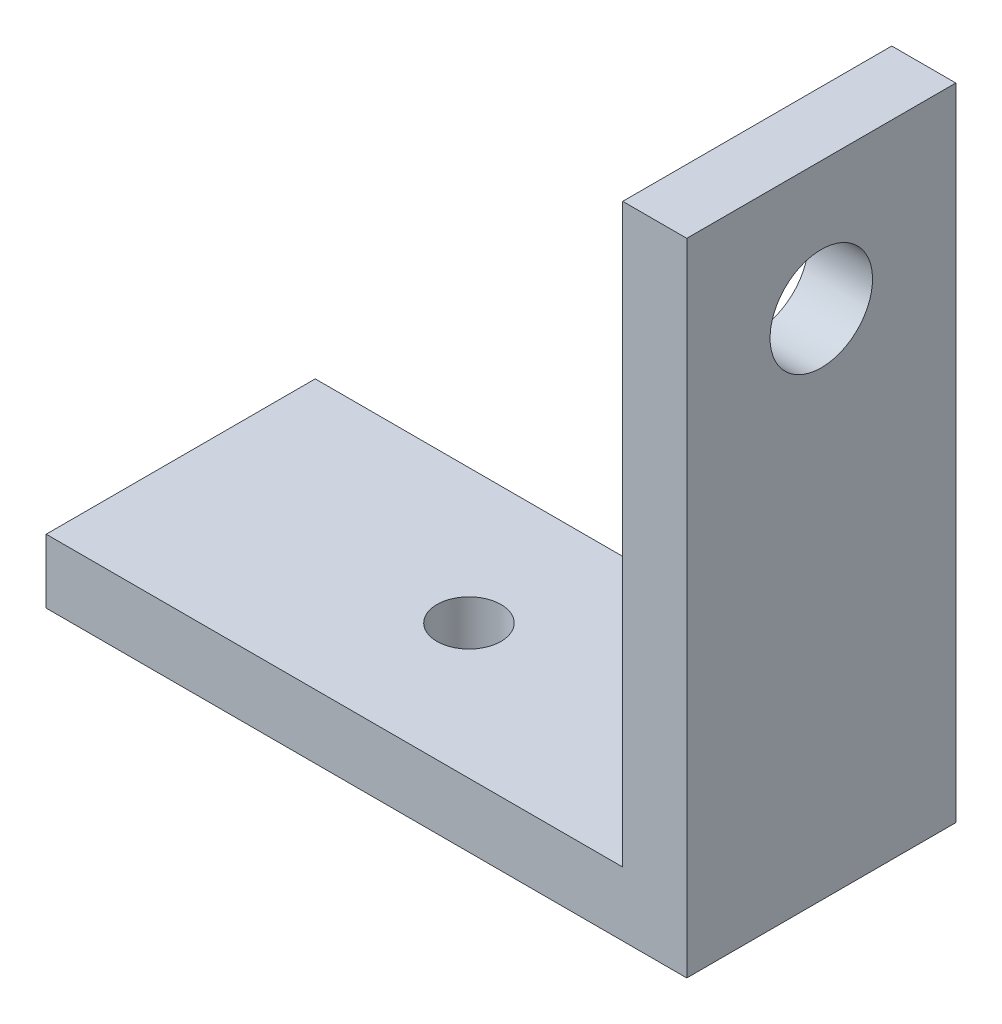
ISO-10303-21;
HEADER;
FILE_DESCRIPTION(('STEP AP214'),'2;1');
FILE_NAME('part.step','',(''),(''),'','','');
FILE_SCHEMA(('AUTOMOTIVE_DESIGN { 1 0 10303 214 1 1 1 1 }'));
ENDSEC;
DATA;
#1=APPLICATION_CONTEXT('core data for automotive mechanical design processes');
#2=APPLICATION_PROTOCOL_DEFINITION('international standard','automotive_design',2000,#1);
#3=PRODUCT_CONTEXT('',#1,'mechanical');
#4=PRODUCT('Part','Part','',(#3));
#5=PRODUCT_RELATED_PRODUCT_CATEGORY('part','',(#4));
#6=PRODUCT_DEFINITION_FORMATION('','',#4);
#7=PRODUCT_DEFINITION_CONTEXT('part definition',#1,'design');
#8=PRODUCT_DEFINITION('design','',#6,#7);
#9=PRODUCT_DEFINITION_SHAPE('','',#8);
#10=(LENGTH_UNIT() NAMED_UNIT(*) SI_UNIT(.MILLI.,.METRE.));
#11=(NAMED_UNIT(*) PLANE_ANGLE_UNIT() SI_UNIT($,.RADIAN.));
#12=(NAMED_UNIT(*) SI_UNIT($,.STERADIAN.) SOLID_ANGLE_UNIT());
#13=UNCERTAINTY_MEASURE_WITH_UNIT(LENGTH_MEASURE(1.E-05),#10,'distance_accuracy_value','');
#14=(GEOMETRIC_REPRESENTATION_CONTEXT(3) GLOBAL_UNCERTAINTY_ASSIGNED_CONTEXT((#13)) GLOBAL_UNIT_ASSIGNED_CONTEXT((#10,
#11,#12)) REPRESENTATION_CONTEXT('',''));
#15=CARTESIAN_POINT('',(0.,0.,0.));
#16=DIRECTION('',(0.,0.,1.));
#17=DIRECTION('',(1.,0.,0.));
#18=AXIS2_PLACEMENT_3D('',#15,#16,#17);
#19=CARTESIAN_POINT('',(-50.,0.,21.));
#20=DIRECTION('',(0.,1.,0.));
#21=DIRECTION('',(0.,0.,1.));
#22=AXIS2_PLACEMENT_3D('',#19,#20,#21);
#23=PLANE('',#22);
#24=CARTESIAN_POINT('',(-27.5,0.,10.5));
#25=DIRECTION('',(0.,1.,0.));
#26=DIRECTION('',(0.,0.,1.));
#27=AXIS2_PLACEMENT_3D('',#24,#25,#26);
#28=CIRCLE('',#27,2.5);
#29=CARTESIAN_POINT('',(-27.5,0.,13.));
#30=VERTEX_POINT('',#29);
#31=EDGE_CURVE('E189',#30,#30,#28,.T.);
#32=ORIENTED_EDGE('',*,*,#31,.T.);
#33=EDGE_LOOP('',(#32));
#34=FACE_BOUND('',#33,.T.);
#35=DIRECTION('',(1.,0.,0.));
#36=VECTOR('',#35,1.);
#37=CARTESIAN_POINT('',(-50.,0.,0.));
#38=LINE('',#37,#36);
#39=CARTESIAN_POINT('',(-50.,0.,0.));
#40=VERTEX_POINT('',#39);
#41=CARTESIAN_POINT('',(0.,0.,0.));
#42=VERTEX_POINT('',#41);
#43=EDGE_CURVE('E132',#40,#42,#38,.T.);
#44=ORIENTED_EDGE('',*,*,#43,.T.);
#45=DIRECTION('',(0.,0.,-1.));
#46=VECTOR('',#45,1.);
#47=CARTESIAN_POINT('',(0.,0.,21.));
#48=LINE('',#47,#46);
#49=CARTESIAN_POINT('',(0.,0.,21.));
#50=VERTEX_POINT('',#49);
#51=EDGE_CURVE('E11',#50,#42,#48,.T.);
#52=ORIENTED_EDGE('',*,*,#51,.F.);
#53=DIRECTION('',(1.,0.,0.));
#54=VECTOR('',#53,1.);
#55=CARTESIAN_POINT('',(-50.,0.,21.));
#56=LINE('',#55,#54);
#57=CARTESIAN_POINT('',(-50.,0.,21.));
#58=VERTEX_POINT('',#57);
#59=EDGE_CURVE('E149',#58,#50,#56,.T.);
#60=ORIENTED_EDGE('',*,*,#59,.F.);
#61=DIRECTION('',(0.,0.,-1.));
#62=VECTOR('',#61,1.);
#63=CARTESIAN_POINT('',(-50.,0.,21.));
#64=LINE('',#63,#62);
#65=EDGE_CURVE('E128',#58,#40,#64,.T.);
#66=ORIENTED_EDGE('',*,*,#65,.T.);
#67=EDGE_LOOP('',(#44,#52,#60,#66));
#68=FACE_BOUND('',#67,.T.);
#69=ADVANCED_FACE('F42',(#34,#68),#23,.F.);
#70=CARTESIAN_POINT('',(0.,0.,21.));
#71=DIRECTION('',(-1.,0.,0.));
#72=DIRECTION('',(0.,0.,1.));
#73=AXIS2_PLACEMENT_3D('',#70,#71,#72);
#74=PLANE('',#73);
#75=CARTESIAN_POINT('',(0.,40.,10.5));
#76=DIRECTION('',(-1.,0.,0.));
#77=DIRECTION('',(0.,-1.,0.));
#78=AXIS2_PLACEMENT_3D('',#75,#76,#77);
#79=CIRCLE('',#78,4.);
#80=CARTESIAN_POINT('',(0.,36.,10.5));
#81=VERTEX_POINT('',#80);
#82=EDGE_CURVE('E137',#81,#81,#79,.T.);
#83=ORIENTED_EDGE('',*,*,#82,.T.);
#84=EDGE_LOOP('',(#83));
#85=FACE_BOUND('',#84,.T.);
#86=DIRECTION('',(0.,1.,0.));
#87=VECTOR('',#86,1.);
#88=CARTESIAN_POINT('',(0.,0.,0.));
#89=LINE('',#88,#87);
#90=CARTESIAN_POINT('',(0.,50.,0.));
#91=VERTEX_POINT('',#90);
#92=EDGE_CURVE('E136',#42,#91,#89,.T.);
#93=ORIENTED_EDGE('',*,*,#92,.T.);
#94=DIRECTION('',(0.,0.,-1.));
#95=VECTOR('',#94,1.);
#96=CARTESIAN_POINT('',(0.,50.,21.));
#97=LINE('',#96,#95);
#98=CARTESIAN_POINT('',(0.,50.,21.));
#99=VERTEX_POINT('',#98);
#100=EDGE_CURVE('E52',#99,#91,#97,.T.);
#101=ORIENTED_EDGE('',*,*,#100,.F.);
#102=DIRECTION('',(0.,1.,0.));
#103=VECTOR('',#102,1.);
#104=CARTESIAN_POINT('',(0.,0.,21.));
#105=LINE('',#104,#103);
#106=EDGE_CURVE('E97',#50,#99,#105,.T.);
#107=ORIENTED_EDGE('',*,*,#106,.F.);
#108=ORIENTED_EDGE('',*,*,#51,.T.);
#109=EDGE_LOOP('',(#93,#101,#107,#108));
#110=FACE_BOUND('',#109,.T.);
#111=ADVANCED_FACE('F180',(#85,#110),#74,.F.);
#112=CARTESIAN_POINT('',(0.,50.,21.));
#113=DIRECTION('',(0.,-1.,0.));
#114=DIRECTION('',(0.,0.,-1.));
#115=AXIS2_PLACEMENT_3D('',#112,#113,#114);
#116=PLANE('',#115);
#117=DIRECTION('',(-1.,0.,0.));
#118=VECTOR('',#117,1.);
#119=CARTESIAN_POINT('',(0.,50.,0.));
#120=LINE('',#119,#118);
#121=CARTESIAN_POINT('',(-5.,50.,0.));
#122=VERTEX_POINT('',#121);
#123=EDGE_CURVE('E140',#91,#122,#120,.T.);
#124=ORIENTED_EDGE('',*,*,#123,.T.);
#125=DIRECTION('',(0.,0.,-1.));
#126=VECTOR('',#125,1.);
#127=CARTESIAN_POINT('',(-5.,50.,21.));
#128=LINE('',#127,#126);
#129=CARTESIAN_POINT('',(-5.,50.,21.));
#130=VERTEX_POINT('',#129);
#131=EDGE_CURVE('E121',#130,#122,#128,.T.);
#132=ORIENTED_EDGE('',*,*,#131,.F.);
#133=DIRECTION('',(-1.,0.,0.));
#134=VECTOR('',#133,1.);
#135=CARTESIAN_POINT('',(0.,50.,21.));
#136=LINE('',#135,#134);
#137=EDGE_CURVE('E110',#99,#130,#136,.T.);
#138=ORIENTED_EDGE('',*,*,#137,.F.);
#139=ORIENTED_EDGE('',*,*,#100,.T.);
#140=EDGE_LOOP('',(#124,#132,#138,#139));
#141=FACE_BOUND('',#140,.T.);
#142=ADVANCED_FACE('F160',(#141),#116,.F.);
#143=CARTESIAN_POINT('',(-5.,50.,21.));
#144=DIRECTION('',(1.,0.,0.));
#145=DIRECTION('',(0.,1.,0.));
#146=AXIS2_PLACEMENT_3D('',#143,#144,#145);
#147=PLANE('',#146);
#148=CARTESIAN_POINT('',(-5.,40.,10.5));
#149=DIRECTION('',(-1.,0.,0.));
#150=DIRECTION('',(0.,-1.,0.));
#151=AXIS2_PLACEMENT_3D('',#148,#149,#150);
#152=CIRCLE('',#151,4.);
#153=CARTESIAN_POINT('',(-5.,36.,10.5));
#154=VERTEX_POINT('',#153);
#155=EDGE_CURVE('E195',#154,#154,#152,.T.);
#156=ORIENTED_EDGE('',*,*,#155,.F.);
#157=EDGE_LOOP('',(#156));
#158=FACE_BOUND('',#157,.T.);
#159=DIRECTION('',(0.,-1.,0.));
#160=VECTOR('',#159,1.);
#161=CARTESIAN_POINT('',(-5.,50.,0.));
#162=LINE('',#161,#160);
#163=CARTESIAN_POINT('',(-4.99999999999999,5.00000000000001,0.));
#164=VERTEX_POINT('',#163);
#165=EDGE_CURVE('E119',#122,#164,#162,.T.);
#166=ORIENTED_EDGE('',*,*,#165,.T.);
#167=DIRECTION('',(0.,0.,-1.));
#168=VECTOR('',#167,1.);
#169=CARTESIAN_POINT('',(-4.99999999999999,5.00000000000001,21.));
#170=LINE('',#169,#168);
#171=CARTESIAN_POINT('',(-4.99999999999999,5.00000000000001,21.));
#172=VERTEX_POINT('',#171);
#173=EDGE_CURVE('E116',#172,#164,#170,.T.);
#174=ORIENTED_EDGE('',*,*,#173,.F.);
#175=DIRECTION('',(0.,-1.,0.));
#176=VECTOR('',#175,1.);
#177=CARTESIAN_POINT('',(-5.,50.,21.));
#178=LINE('',#177,#176);
#179=EDGE_CURVE('E104',#130,#172,#178,.T.);
#180=ORIENTED_EDGE('',*,*,#179,.F.);
#181=ORIENTED_EDGE('',*,*,#131,.T.);
#182=EDGE_LOOP('',(#166,#174,#180,#181));
#183=FACE_BOUND('',#182,.T.);
#184=ADVANCED_FACE('F117',(#158,#183),#147,.F.);
#185=CARTESIAN_POINT('',(-4.99999999999999,5.00000000000001,21.));
#186=DIRECTION('',(0.,-1.,0.));
#187=DIRECTION('',(1.,0.,0.));
#188=AXIS2_PLACEMENT_3D('',#185,#186,#187);
#189=PLANE('',#188);
#190=CARTESIAN_POINT('',(-27.5,5.,10.5));
#191=DIRECTION('',(0.,-1.,0.));
#192=DIRECTION('',(1.,0.,0.));
#193=AXIS2_PLACEMENT_3D('',#190,#191,#192);
#194=CIRCLE('',#193,2.5);
#195=CARTESIAN_POINT('',(-25.,5.,10.5));
#196=VERTEX_POINT('',#195);
#197=EDGE_CURVE('E45',#196,#196,#194,.F.);
#198=ORIENTED_EDGE('',*,*,#197,.F.);
#199=EDGE_LOOP('',(#198));
#200=FACE_BOUND('',#199,.T.);
#201=DIRECTION('',(-1.,0.,0.));
#202=VECTOR('',#201,1.);
#203=CARTESIAN_POINT('',(-4.99999999999999,5.00000000000001,0.));
#204=LINE('',#203,#202);
#205=CARTESIAN_POINT('',(-50.,5.,0.));
#206=VERTEX_POINT('',#205);
#207=EDGE_CURVE('E83',#164,#206,#204,.T.);
#208=ORIENTED_EDGE('',*,*,#207,.T.);
#209=DIRECTION('',(0.,0.,-1.));
#210=VECTOR('',#209,1.);
#211=CARTESIAN_POINT('',(-50.,5.,21.));
#212=LINE('',#211,#210);
#213=CARTESIAN_POINT('',(-50.,5.,21.));
#214=VERTEX_POINT('',#213);
#215=EDGE_CURVE('E122',#214,#206,#212,.T.);
#216=ORIENTED_EDGE('',*,*,#215,.F.);
#217=DIRECTION('',(-1.,0.,0.));
#218=VECTOR('',#217,1.);
#219=CARTESIAN_POINT('',(-4.99999999999999,5.00000000000001,21.));
#220=LINE('',#219,#218);
#221=EDGE_CURVE('E108',#172,#214,#220,.T.);
#222=ORIENTED_EDGE('',*,*,#221,.F.);
#223=ORIENTED_EDGE('',*,*,#173,.T.);
#224=EDGE_LOOP('',(#208,#216,#222,#223));
#225=FACE_BOUND('',#224,.T.);
#226=ADVANCED_FACE('F124',(#200,#225),#189,.F.);
#227=CARTESIAN_POINT('',(-50.,5.,21.));
#228=DIRECTION('',(1.,0.,0.));
#229=DIRECTION('',(0.,0.,-1.));
#230=AXIS2_PLACEMENT_3D('',#227,#228,#229);
#231=PLANE('',#230);
#232=DIRECTION('',(0.,-1.,0.));
#233=VECTOR('',#232,1.);
#234=CARTESIAN_POINT('',(-50.,5.,0.));
#235=LINE('',#234,#233);
#236=EDGE_CURVE('E89',#206,#40,#235,.T.);
#237=ORIENTED_EDGE('',*,*,#236,.T.);
#238=ORIENTED_EDGE('',*,*,#65,.F.);
#239=DIRECTION('',(0.,-1.,0.));
#240=VECTOR('',#239,1.);
#241=CARTESIAN_POINT('',(-50.,5.,21.));
#242=LINE('',#241,#240);
#243=EDGE_CURVE('E60',#214,#58,#242,.T.);
#244=ORIENTED_EDGE('',*,*,#243,.F.);
#245=ORIENTED_EDGE('',*,*,#215,.T.);
#246=EDGE_LOOP('',(#237,#238,#244,#245));
#247=FACE_BOUND('',#246,.T.);
#248=ADVANCED_FACE('F167',(#247),#231,.F.);
#249=CARTESIAN_POINT('',(0.,0.,21.));
#250=DIRECTION('',(0.,0.,1.));
#251=DIRECTION('',(1.,0.,0.));
#252=AXIS2_PLACEMENT_3D('',#249,#250,#251);
#253=PLANE('',#252);
#254=ORIENTED_EDGE('',*,*,#59,.T.);
#255=ORIENTED_EDGE('',*,*,#106,.T.);
#256=ORIENTED_EDGE('',*,*,#137,.T.);
#257=ORIENTED_EDGE('',*,*,#179,.T.);
#258=ORIENTED_EDGE('',*,*,#221,.T.);
#259=ORIENTED_EDGE('',*,*,#243,.T.);
#260=EDGE_LOOP('',(#254,#255,#256,#257,#258,#259));
#261=FACE_BOUND('',#260,.T.);
#262=ADVANCED_FACE('F106',(#261),#253,.T.);
#263=CARTESIAN_POINT('',(0.,0.,0.));
#264=DIRECTION('',(0.,0.,1.));
#265=DIRECTION('',(1.,0.,0.));
#266=AXIS2_PLACEMENT_3D('',#263,#264,#265);
#267=PLANE('',#266);
#268=ORIENTED_EDGE('',*,*,#43,.F.);
#269=ORIENTED_EDGE('',*,*,#236,.F.);
#270=ORIENTED_EDGE('',*,*,#207,.F.);
#271=ORIENTED_EDGE('',*,*,#165,.F.);
#272=ORIENTED_EDGE('',*,*,#123,.F.);
#273=ORIENTED_EDGE('',*,*,#92,.F.);
#274=EDGE_LOOP('',(#268,#269,#270,#271,#272,#273));
#275=FACE_BOUND('',#274,.T.);
#276=ADVANCED_FACE('F163',(#275),#267,.F.);
#277=CARTESIAN_POINT('',(0.,40.,10.5));
#278=DIRECTION('',(-1.,0.,0.));
#279=DIRECTION('',(0.,-1.,0.));
#280=AXIS2_PLACEMENT_3D('',#277,#278,#279);
#281=CYLINDRICAL_SURFACE('',#280,4.);
#282=ORIENTED_EDGE('',*,*,#82,.F.);
#283=EDGE_LOOP('',(#282));
#284=FACE_BOUND('',#283,.T.);
#285=ORIENTED_EDGE('',*,*,#155,.T.);
#286=EDGE_LOOP('',(#285));
#287=FACE_BOUND('',#286,.T.);
#288=ADVANCED_FACE('F209',(#284,#287),#281,.F.);
#289=CARTESIAN_POINT('',(-27.5,50.,10.5));
#290=DIRECTION('',(0.,-1.,0.));
#291=DIRECTION('',(0.,0.,-1.));
#292=AXIS2_PLACEMENT_3D('',#289,#290,#291);
#293=CYLINDRICAL_SURFACE('',#292,2.5);
#294=ORIENTED_EDGE('',*,*,#31,.F.);
#295=EDGE_LOOP('',(#294));
#296=FACE_BOUND('',#295,.T.);
#297=ORIENTED_EDGE('',*,*,#197,.T.);
#298=EDGE_LOOP('',(#297));
#299=FACE_BOUND('',#298,.T.);
#300=ADVANCED_FACE('F237',(#296,#299),#293,.F.);
#301=CLOSED_SHELL('',(#69,#111,#142,#184,#226,#248,#262,#276,#288,#300));
#302=MANIFOLD_SOLID_BREP('B2',#301);
#303=ADVANCED_BREP_SHAPE_REPRESENTATION('',(#18,#302),#14);
#304=SHAPE_DEFINITION_REPRESENTATION(#9,#303);
ENDSEC;
END-ISO-10303-21;
